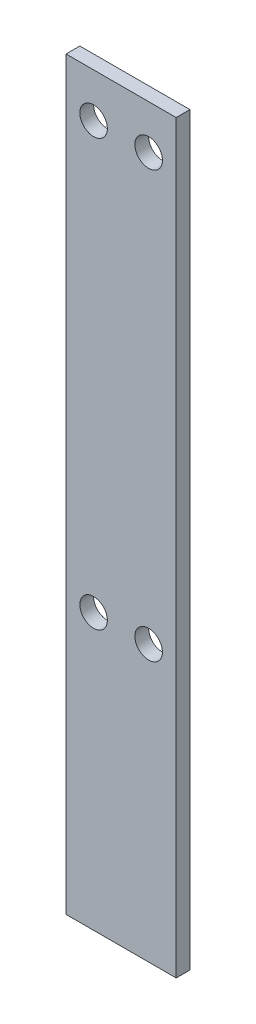
ISO-10303-21;
HEADER;
FILE_DESCRIPTION(('STEP AP214'),'2;1');
FILE_NAME('part.step','',(''),(''),'','','');
FILE_SCHEMA(('AUTOMOTIVE_DESIGN { 1 0 10303 214 1 1 1 1 }'));
ENDSEC;
DATA;
#1=APPLICATION_CONTEXT('core data for automotive mechanical design processes');
#2=APPLICATION_PROTOCOL_DEFINITION('international standard','automotive_design',2000,#1);
#3=PRODUCT_CONTEXT('',#1,'mechanical');
#4=PRODUCT('Part','Part','',(#3));
#5=PRODUCT_RELATED_PRODUCT_CATEGORY('part','',(#4));
#6=PRODUCT_DEFINITION_FORMATION('','',#4);
#7=PRODUCT_DEFINITION_CONTEXT('part definition',#1,'design');
#8=PRODUCT_DEFINITION('design','',#6,#7);
#9=PRODUCT_DEFINITION_SHAPE('','',#8);
#10=(LENGTH_UNIT() NAMED_UNIT(*) SI_UNIT(.MILLI.,.METRE.));
#11=(NAMED_UNIT(*) PLANE_ANGLE_UNIT() SI_UNIT($,.RADIAN.));
#12=(NAMED_UNIT(*) SI_UNIT($,.STERADIAN.) SOLID_ANGLE_UNIT());
#13=UNCERTAINTY_MEASURE_WITH_UNIT(LENGTH_MEASURE(1.E-05),#10,'distance_accuracy_value','');
#14=(GEOMETRIC_REPRESENTATION_CONTEXT(3) GLOBAL_UNCERTAINTY_ASSIGNED_CONTEXT((#13)) GLOBAL_UNIT_ASSIGNED_CONTEXT((#10,
#11,#12)) REPRESENTATION_CONTEXT('',''));
#15=CARTESIAN_POINT('',(0.,0.,0.));
#16=DIRECTION('',(0.,0.,1.));
#17=DIRECTION('',(1.,0.,0.));
#18=AXIS2_PLACEMENT_3D('',#15,#16,#17);
#19=CARTESIAN_POINT('',(0.,0.,4.7625));
#20=DIRECTION('',(0.,0.,-1.));
#21=DIRECTION('',(-1.,0.,0.));
#22=AXIS2_PLACEMENT_3D('',#19,#20,#21);
#23=PLANE('',#22);
#24=DIRECTION('',(0.,-1.,0.));
#25=VECTOR('',#24,1.);
#26=CARTESIAN_POINT('',(0.,0.,4.7625));
#27=LINE('',#26,#25);
#28=CARTESIAN_POINT('',(0.,257.81,4.7625));
#29=VERTEX_POINT('',#28);
#30=CARTESIAN_POINT('',(0.,0.,4.7625));
#31=VERTEX_POINT('',#30);
#32=EDGE_CURVE('E96',#29,#31,#27,.T.);
#33=ORIENTED_EDGE('',*,*,#32,.T.);
#34=DIRECTION('',(1.,0.,0.));
#35=VECTOR('',#34,1.);
#36=CARTESIAN_POINT('',(0.,0.,4.7625));
#37=LINE('',#36,#35);
#38=CARTESIAN_POINT('',(38.1,0.,4.7625));
#39=VERTEX_POINT('',#38);
#40=EDGE_CURVE('E91',#31,#39,#37,.T.);
#41=ORIENTED_EDGE('',*,*,#40,.T.);
#42=DIRECTION('',(0.,1.,0.));
#43=VECTOR('',#42,1.);
#44=CARTESIAN_POINT('',(38.1,0.,4.7625));
#45=LINE('',#44,#43);
#46=CARTESIAN_POINT('',(38.1,257.81,4.7625));
#47=VERTEX_POINT('',#46);
#48=EDGE_CURVE('E94',#39,#47,#45,.T.);
#49=ORIENTED_EDGE('',*,*,#48,.T.);
#50=DIRECTION('',(-1.,0.,0.));
#51=VECTOR('',#50,1.);
#52=CARTESIAN_POINT('',(0.,257.81,4.7625));
#53=LINE('',#52,#51);
#54=EDGE_CURVE('E61',#47,#29,#53,.T.);
#55=ORIENTED_EDGE('',*,*,#54,.T.);
#56=EDGE_LOOP('',(#33,#41,#49,#55));
#57=FACE_BOUND('',#56,.T.);
#58=CARTESIAN_POINT('',(9.525,95.25,4.7625));
#59=DIRECTION('',(0.,0.,1.));
#60=DIRECTION('',(1.,0.,0.));
#61=AXIS2_PLACEMENT_3D('',#58,#59,#60);
#62=CIRCLE('',#61,4.7625);
#63=CARTESIAN_POINT('',(4.7625,95.25,4.7625));
#64=VERTEX_POINT('',#63);
#65=EDGE_CURVE('E116',#64,#64,#62,.T.);
#66=ORIENTED_EDGE('',*,*,#65,.F.);
#67=EDGE_LOOP('',(#66));
#68=FACE_BOUND('',#67,.T.);
#69=CARTESIAN_POINT('',(28.575,95.25,4.7625));
#70=DIRECTION('',(0.,0.,1.));
#71=DIRECTION('',(1.,0.,0.));
#72=AXIS2_PLACEMENT_3D('',#69,#70,#71);
#73=CIRCLE('',#72,4.7625);
#74=CARTESIAN_POINT('',(23.8125,95.25,4.7625));
#75=VERTEX_POINT('',#74);
#76=EDGE_CURVE('E138',#75,#75,#73,.T.);
#77=ORIENTED_EDGE('',*,*,#76,.F.);
#78=EDGE_LOOP('',(#77));
#79=FACE_BOUND('',#78,.T.);
#80=CARTESIAN_POINT('',(9.525,242.57,4.7625));
#81=DIRECTION('',(0.,0.,1.));
#82=DIRECTION('',(1.,0.,0.));
#83=AXIS2_PLACEMENT_3D('',#80,#81,#82);
#84=CIRCLE('',#83,4.7625);
#85=CARTESIAN_POINT('',(4.76250000000001,242.57,4.7625));
#86=VERTEX_POINT('',#85);
#87=EDGE_CURVE('E146',#86,#86,#84,.T.);
#88=ORIENTED_EDGE('',*,*,#87,.F.);
#89=EDGE_LOOP('',(#88));
#90=FACE_BOUND('',#89,.T.);
#91=CARTESIAN_POINT('',(28.575,242.57,4.7625));
#92=DIRECTION('',(0.,0.,1.));
#93=DIRECTION('',(1.,0.,0.));
#94=AXIS2_PLACEMENT_3D('',#91,#92,#93);
#95=CIRCLE('',#94,4.7625);
#96=CARTESIAN_POINT('',(23.8125,242.57,4.7625));
#97=VERTEX_POINT('',#96);
#98=EDGE_CURVE('E154',#97,#97,#95,.T.);
#99=ORIENTED_EDGE('',*,*,#98,.F.);
#100=EDGE_LOOP('',(#99));
#101=FACE_BOUND('',#100,.T.);
#102=ADVANCED_FACE('F43',(#57,#68,#79,#90,#101),#23,.F.);
#103=CARTESIAN_POINT('',(0.,0.,0.));
#104=DIRECTION('',(0.,0.,-1.));
#105=DIRECTION('',(-1.,0.,0.));
#106=AXIS2_PLACEMENT_3D('',#103,#104,#105);
#107=PLANE('',#106);
#108=CARTESIAN_POINT('',(9.525,242.57,0.));
#109=DIRECTION('',(0.,0.,1.));
#110=DIRECTION('',(1.,0.,0.));
#111=AXIS2_PLACEMENT_3D('',#108,#109,#110);
#112=CIRCLE('',#111,4.7625);
#113=CARTESIAN_POINT('',(4.76250000000001,242.57,0.));
#114=VERTEX_POINT('',#113);
#115=EDGE_CURVE('E150',#114,#114,#112,.T.);
#116=ORIENTED_EDGE('',*,*,#115,.T.);
#117=EDGE_LOOP('',(#116));
#118=FACE_BOUND('',#117,.T.);
#119=CARTESIAN_POINT('',(9.525,95.25,0.));
#120=DIRECTION('',(0.,0.,1.));
#121=DIRECTION('',(1.,0.,0.));
#122=AXIS2_PLACEMENT_3D('',#119,#120,#121);
#123=CIRCLE('',#122,4.7625);
#124=CARTESIAN_POINT('',(4.7625,95.25,0.));
#125=VERTEX_POINT('',#124);
#126=EDGE_CURVE('E134',#125,#125,#123,.T.);
#127=ORIENTED_EDGE('',*,*,#126,.T.);
#128=EDGE_LOOP('',(#127));
#129=FACE_BOUND('',#128,.T.);
#130=DIRECTION('',(0.,-1.,0.));
#131=VECTOR('',#130,1.);
#132=CARTESIAN_POINT('',(0.,0.,0.));
#133=LINE('',#132,#131);
#134=CARTESIAN_POINT('',(0.,257.81,0.));
#135=VERTEX_POINT('',#134);
#136=CARTESIAN_POINT('',(0.,0.,0.));
#137=VERTEX_POINT('',#136);
#138=EDGE_CURVE('E112',#135,#137,#133,.T.);
#139=ORIENTED_EDGE('',*,*,#138,.F.);
#140=DIRECTION('',(-1.,0.,0.));
#141=VECTOR('',#140,1.);
#142=CARTESIAN_POINT('',(0.,257.81,0.));
#143=LINE('',#142,#141);
#144=CARTESIAN_POINT('',(38.1,257.81,0.));
#145=VERTEX_POINT('',#144);
#146=EDGE_CURVE('E84',#145,#135,#143,.T.);
#147=ORIENTED_EDGE('',*,*,#146,.F.);
#148=DIRECTION('',(0.,1.,0.));
#149=VECTOR('',#148,1.);
#150=CARTESIAN_POINT('',(38.1,0.,0.));
#151=LINE('',#150,#149);
#152=CARTESIAN_POINT('',(38.1,0.,0.));
#153=VERTEX_POINT('',#152);
#154=EDGE_CURVE('E78',#153,#145,#151,.T.);
#155=ORIENTED_EDGE('',*,*,#154,.F.);
#156=DIRECTION('',(1.,0.,0.));
#157=VECTOR('',#156,1.);
#158=CARTESIAN_POINT('',(0.,0.,0.));
#159=LINE('',#158,#157);
#160=EDGE_CURVE('E101',#137,#153,#159,.T.);
#161=ORIENTED_EDGE('',*,*,#160,.F.);
#162=EDGE_LOOP('',(#139,#147,#155,#161));
#163=FACE_BOUND('',#162,.T.);
#164=CARTESIAN_POINT('',(28.575,95.25,0.));
#165=DIRECTION('',(0.,0.,1.));
#166=DIRECTION('',(1.,0.,0.));
#167=AXIS2_PLACEMENT_3D('',#164,#165,#166);
#168=CIRCLE('',#167,4.7625);
#169=CARTESIAN_POINT('',(23.8125,95.25,0.));
#170=VERTEX_POINT('',#169);
#171=EDGE_CURVE('E142',#170,#170,#168,.T.);
#172=ORIENTED_EDGE('',*,*,#171,.T.);
#173=EDGE_LOOP('',(#172));
#174=FACE_BOUND('',#173,.T.);
#175=CARTESIAN_POINT('',(28.575,242.57,0.));
#176=DIRECTION('',(0.,0.,1.));
#177=DIRECTION('',(1.,0.,0.));
#178=AXIS2_PLACEMENT_3D('',#175,#176,#177);
#179=CIRCLE('',#178,4.7625);
#180=CARTESIAN_POINT('',(23.8125,242.57,0.));
#181=VERTEX_POINT('',#180);
#182=EDGE_CURVE('E158',#181,#181,#179,.T.);
#183=ORIENTED_EDGE('',*,*,#182,.T.);
#184=EDGE_LOOP('',(#183));
#185=FACE_BOUND('',#184,.T.);
#186=ADVANCED_FACE('F129',(#118,#129,#163,#174,#185),#107,.T.);
#187=CARTESIAN_POINT('',(0.,0.,4.7625));
#188=DIRECTION('',(1.,0.,0.));
#189=DIRECTION('',(0.,0.,-1.));
#190=AXIS2_PLACEMENT_3D('',#187,#188,#189);
#191=PLANE('',#190);
#192=ORIENTED_EDGE('',*,*,#138,.T.);
#193=DIRECTION('',(0.,0.,-1.));
#194=VECTOR('',#193,1.);
#195=CARTESIAN_POINT('',(0.,0.,4.7625));
#196=LINE('',#195,#194);
#197=EDGE_CURVE('E11',#31,#137,#196,.T.);
#198=ORIENTED_EDGE('',*,*,#197,.F.);
#199=ORIENTED_EDGE('',*,*,#32,.F.);
#200=DIRECTION('',(0.,0.,-1.));
#201=VECTOR('',#200,1.);
#202=CARTESIAN_POINT('',(0.,257.81,4.7625));
#203=LINE('',#202,#201);
#204=EDGE_CURVE('E108',#29,#135,#203,.T.);
#205=ORIENTED_EDGE('',*,*,#204,.T.);
#206=EDGE_LOOP('',(#192,#198,#199,#205));
#207=FACE_BOUND('',#206,.T.);
#208=ADVANCED_FACE('F45',(#207),#191,.F.);
#209=CARTESIAN_POINT('',(0.,0.,4.7625));
#210=DIRECTION('',(0.,1.,0.));
#211=DIRECTION('',(0.,0.,1.));
#212=AXIS2_PLACEMENT_3D('',#209,#210,#211);
#213=PLANE('',#212);
#214=ORIENTED_EDGE('',*,*,#160,.T.);
#215=DIRECTION('',(0.,0.,-1.));
#216=VECTOR('',#215,1.);
#217=CARTESIAN_POINT('',(38.1,0.,4.7625));
#218=LINE('',#217,#216);
#219=EDGE_CURVE('E53',#39,#153,#218,.T.);
#220=ORIENTED_EDGE('',*,*,#219,.F.);
#221=ORIENTED_EDGE('',*,*,#40,.F.);
#222=ORIENTED_EDGE('',*,*,#197,.T.);
#223=EDGE_LOOP('',(#214,#220,#221,#222));
#224=FACE_BOUND('',#223,.T.);
#225=ADVANCED_FACE('F100',(#224),#213,.F.);
#226=CARTESIAN_POINT('',(38.1,0.,4.7625));
#227=DIRECTION('',(-1.,0.,0.));
#228=DIRECTION('',(0.,0.,1.));
#229=AXIS2_PLACEMENT_3D('',#226,#227,#228);
#230=PLANE('',#229);
#231=ORIENTED_EDGE('',*,*,#154,.T.);
#232=DIRECTION('',(0.,0.,-1.));
#233=VECTOR('',#232,1.);
#234=CARTESIAN_POINT('',(38.1,257.81,4.7625));
#235=LINE('',#234,#233);
#236=EDGE_CURVE('E103',#47,#145,#235,.T.);
#237=ORIENTED_EDGE('',*,*,#236,.F.);
#238=ORIENTED_EDGE('',*,*,#48,.F.);
#239=ORIENTED_EDGE('',*,*,#219,.T.);
#240=EDGE_LOOP('',(#231,#237,#238,#239));
#241=FACE_BOUND('',#240,.T.);
#242=ADVANCED_FACE('F104',(#241),#230,.F.);
#243=CARTESIAN_POINT('',(0.,257.81,4.7625));
#244=DIRECTION('',(0.,-1.,0.));
#245=DIRECTION('',(0.,0.,-1.));
#246=AXIS2_PLACEMENT_3D('',#243,#244,#245);
#247=PLANE('',#246);
#248=ORIENTED_EDGE('',*,*,#146,.T.);
#249=ORIENTED_EDGE('',*,*,#204,.F.);
#250=ORIENTED_EDGE('',*,*,#54,.F.);
#251=ORIENTED_EDGE('',*,*,#236,.T.);
#252=EDGE_LOOP('',(#248,#249,#250,#251));
#253=FACE_BOUND('',#252,.T.);
#254=ADVANCED_FACE('F126',(#253),#247,.F.);
#255=CARTESIAN_POINT('',(9.525,95.25,4.7625));
#256=DIRECTION('',(0.,0.,-1.));
#257=DIRECTION('',(-1.,0.,0.));
#258=AXIS2_PLACEMENT_3D('',#255,#256,#257);
#259=CYLINDRICAL_SURFACE('',#258,4.7625);
#260=CARTESIAN_POINT('',(4.7625,95.25,4.7625));
#261=CARTESIAN_POINT('',(4.7625,95.25,4.712890625));
#262=CARTESIAN_POINT('',(4.7625,95.25,4.66328125));
#263=CARTESIAN_POINT('',(4.7625,95.25,4.5640625));
#264=CARTESIAN_POINT('',(4.7625,95.25,4.514453125));
#265=CARTESIAN_POINT('',(4.7625,95.25,4.415234375));
#266=CARTESIAN_POINT('',(4.7625,95.25,4.365625));
#267=CARTESIAN_POINT('',(4.7625,95.25,4.26640625));
#268=CARTESIAN_POINT('',(4.7625,95.25,4.216796875));
#269=CARTESIAN_POINT('',(4.7625,95.25,4.117578125));
#270=CARTESIAN_POINT('',(4.7625,95.25,4.06796875));
#271=CARTESIAN_POINT('',(4.7625,95.25,3.96875));
#272=CARTESIAN_POINT('',(4.7625,95.25,3.919140625));
#273=CARTESIAN_POINT('',(4.7625,95.25,3.819921875));
#274=CARTESIAN_POINT('',(4.7625,95.25,3.7703125));
#275=CARTESIAN_POINT('',(4.7625,95.25,3.67109375));
#276=CARTESIAN_POINT('',(4.7625,95.25,3.621484375));
#277=CARTESIAN_POINT('',(4.7625,95.25,3.522265625));
#278=CARTESIAN_POINT('',(4.7625,95.25,3.47265625));
#279=CARTESIAN_POINT('',(4.7625,95.25,3.3734375));
#280=CARTESIAN_POINT('',(4.7625,95.25,3.323828125));
#281=CARTESIAN_POINT('',(4.7625,95.25,3.224609375));
#282=CARTESIAN_POINT('',(4.7625,95.25,3.175));
#283=CARTESIAN_POINT('',(4.7625,95.25,3.07578125));
#284=CARTESIAN_POINT('',(4.7625,95.25,3.026171875));
#285=CARTESIAN_POINT('',(4.7625,95.25,2.926953125));
#286=CARTESIAN_POINT('',(4.7625,95.25,2.87734375));
#287=CARTESIAN_POINT('',(4.7625,95.25,2.778125));
#288=CARTESIAN_POINT('',(4.7625,95.25,2.728515625));
#289=CARTESIAN_POINT('',(4.7625,95.25,2.629296875));
#290=CARTESIAN_POINT('',(4.7625,95.25,2.5796875));
#291=CARTESIAN_POINT('',(4.7625,95.25,2.48046875));
#292=CARTESIAN_POINT('',(4.7625,95.25,2.430859375));
#293=CARTESIAN_POINT('',(4.7625,95.25,2.331640625));
#294=CARTESIAN_POINT('',(4.7625,95.25,2.28203125));
#295=CARTESIAN_POINT('',(4.7625,95.25,2.1828125));
#296=CARTESIAN_POINT('',(4.7625,95.25,2.133203125));
#297=CARTESIAN_POINT('',(4.7625,95.25,2.033984375));
#298=CARTESIAN_POINT('',(4.7625,95.25,1.984375));
#299=CARTESIAN_POINT('',(4.7625,95.25,1.88515625));
#300=CARTESIAN_POINT('',(4.7625,95.25,1.835546875));
#301=CARTESIAN_POINT('',(4.7625,95.25,1.736328125));
#302=CARTESIAN_POINT('',(4.7625,95.25,1.68671875));
#303=CARTESIAN_POINT('',(4.7625,95.25,1.5875));
#304=CARTESIAN_POINT('',(4.7625,95.25,1.537890625));
#305=CARTESIAN_POINT('',(4.7625,95.25,1.438671875));
#306=CARTESIAN_POINT('',(4.7625,95.25,1.3890625));
#307=CARTESIAN_POINT('',(4.7625,95.25,1.28984375));
#308=CARTESIAN_POINT('',(4.7625,95.25,1.240234375));
#309=CARTESIAN_POINT('',(4.7625,95.25,1.141015625));
#310=CARTESIAN_POINT('',(4.7625,95.25,1.09140625));
#311=CARTESIAN_POINT('',(4.7625,95.25,0.992187499999999));
#312=CARTESIAN_POINT('',(4.7625,95.25,0.942578124999999));
#313=CARTESIAN_POINT('',(4.7625,95.25,0.843359375));
#314=CARTESIAN_POINT('',(4.7625,95.25,0.79375));
#315=CARTESIAN_POINT('',(4.7625,95.25,0.69453125));
#316=CARTESIAN_POINT('',(4.7625,95.25,0.644921875));
#317=CARTESIAN_POINT('',(4.7625,95.25,0.545703125));
#318=CARTESIAN_POINT('',(4.7625,95.25,0.49609375));
#319=CARTESIAN_POINT('',(4.7625,95.25,0.396875));
#320=CARTESIAN_POINT('',(4.7625,95.25,0.347265625));
#321=CARTESIAN_POINT('',(4.7625,95.25,0.248046875));
#322=CARTESIAN_POINT('',(4.7625,95.25,0.1984375));
#323=CARTESIAN_POINT('',(4.7625,95.25,0.09921875));
#324=CARTESIAN_POINT('',(4.7625,95.25,0.049609375));
#325=CARTESIAN_POINT('',(4.7625,95.25,0.));
#326=B_SPLINE_CURVE_WITH_KNOTS('',3,(#260,#261,#262,#263,#264,#265,#266,#267,#268,#269,#270,
#271,#272,#273,#274,#275,#276,#277,#278,#279,#280,#281,#282,#283,#284,#285,#286,#287,#288,#289,
#290,#291,#292,#293,#294,#295,#296,#297,#298,#299,#300,#301,#302,#303,#304,#305,#306,#307,#308,
#309,#310,#311,#312,#313,#314,#315,#316,#317,#318,#319,#320,#321,#322,#323,#324,#325),
.UNSPECIFIED.,.F.,.F.,(4,2,2,2,2,2,2,2,2,2,2,2,2,2,2,2,2,2,2,2,2,2,2,2,2,2,2,2,2,2,2,2,4),(0.,
0.148828125,0.29765625,0.446484375,0.5953125,0.744140625,0.892968750000001,1.041796875,1.190625,
1.339453125,1.48828125,1.637109375,1.7859375,1.934765625,2.08359375,2.232421875,2.38125,
2.530078125,2.67890625,2.827734375,2.9765625,3.125390625,3.27421875,3.423046875,3.571875,
3.720703125,3.86953125,4.018359375,4.1671875,4.316015625,4.46484375,4.613671875,4.7625),.UNSPECIFIED.);
#327=EDGE_CURVE('BSEAM177',#64,#125,#326,.T.);
#328=ORIENTED_EDGE('',*,*,#65,.T.);
#329=ORIENTED_EDGE('',*,*,#126,.F.);
#330=ORIENTED_EDGE('',*,*,#327,.T.);
#331=ORIENTED_EDGE('',*,*,#327,.F.);
#332=EDGE_LOOP('',(#328,#330,#329,#331));
#333=FACE_BOUND('',#332,.T.);
#334=ADVANCED_FACE('F177',(#333),#259,.F.);
#335=CARTESIAN_POINT('',(28.575,95.25,4.7625));
#336=DIRECTION('',(0.,0.,-1.));
#337=DIRECTION('',(-1.,0.,0.));
#338=AXIS2_PLACEMENT_3D('',#335,#336,#337);
#339=CYLINDRICAL_SURFACE('',#338,4.7625);
#340=CARTESIAN_POINT('',(23.8125,95.25,4.7625));
#341=CARTESIAN_POINT('',(23.8125,95.25,4.712890625));
#342=CARTESIAN_POINT('',(23.8125,95.25,4.66328125));
#343=CARTESIAN_POINT('',(23.8125,95.25,4.5640625));
#344=CARTESIAN_POINT('',(23.8125,95.25,4.514453125));
#345=CARTESIAN_POINT('',(23.8125,95.25,4.415234375));
#346=CARTESIAN_POINT('',(23.8125,95.25,4.365625));
#347=CARTESIAN_POINT('',(23.8125,95.25,4.26640625));
#348=CARTESIAN_POINT('',(23.8125,95.25,4.216796875));
#349=CARTESIAN_POINT('',(23.8125,95.25,4.117578125));
#350=CARTESIAN_POINT('',(23.8125,95.25,4.06796875));
#351=CARTESIAN_POINT('',(23.8125,95.25,3.96875));
#352=CARTESIAN_POINT('',(23.8125,95.25,3.919140625));
#353=CARTESIAN_POINT('',(23.8125,95.25,3.819921875));
#354=CARTESIAN_POINT('',(23.8125,95.25,3.7703125));
#355=CARTESIAN_POINT('',(23.8125,95.25,3.67109375));
#356=CARTESIAN_POINT('',(23.8125,95.25,3.621484375));
#357=CARTESIAN_POINT('',(23.8125,95.25,3.522265625));
#358=CARTESIAN_POINT('',(23.8125,95.25,3.47265625));
#359=CARTESIAN_POINT('',(23.8125,95.25,3.3734375));
#360=CARTESIAN_POINT('',(23.8125,95.25,3.323828125));
#361=CARTESIAN_POINT('',(23.8125,95.25,3.224609375));
#362=CARTESIAN_POINT('',(23.8125,95.25,3.175));
#363=CARTESIAN_POINT('',(23.8125,95.25,3.07578125));
#364=CARTESIAN_POINT('',(23.8125,95.25,3.026171875));
#365=CARTESIAN_POINT('',(23.8125,95.25,2.926953125));
#366=CARTESIAN_POINT('',(23.8125,95.25,2.87734375));
#367=CARTESIAN_POINT('',(23.8125,95.25,2.778125));
#368=CARTESIAN_POINT('',(23.8125,95.25,2.728515625));
#369=CARTESIAN_POINT('',(23.8125,95.25,2.629296875));
#370=CARTESIAN_POINT('',(23.8125,95.25,2.5796875));
#371=CARTESIAN_POINT('',(23.8125,95.25,2.48046875));
#372=CARTESIAN_POINT('',(23.8125,95.25,2.430859375));
#373=CARTESIAN_POINT('',(23.8125,95.25,2.331640625));
#374=CARTESIAN_POINT('',(23.8125,95.25,2.28203125));
#375=CARTESIAN_POINT('',(23.8125,95.25,2.1828125));
#376=CARTESIAN_POINT('',(23.8125,95.25,2.133203125));
#377=CARTESIAN_POINT('',(23.8125,95.25,2.033984375));
#378=CARTESIAN_POINT('',(23.8125,95.25,1.984375));
#379=CARTESIAN_POINT('',(23.8125,95.25,1.88515625));
#380=CARTESIAN_POINT('',(23.8125,95.25,1.835546875));
#381=CARTESIAN_POINT('',(23.8125,95.25,1.736328125));
#382=CARTESIAN_POINT('',(23.8125,95.25,1.68671875));
#383=CARTESIAN_POINT('',(23.8125,95.25,1.5875));
#384=CARTESIAN_POINT('',(23.8125,95.25,1.537890625));
#385=CARTESIAN_POINT('',(23.8125,95.25,1.438671875));
#386=CARTESIAN_POINT('',(23.8125,95.25,1.3890625));
#387=CARTESIAN_POINT('',(23.8125,95.25,1.28984375));
#388=CARTESIAN_POINT('',(23.8125,95.25,1.240234375));
#389=CARTESIAN_POINT('',(23.8125,95.25,1.141015625));
#390=CARTESIAN_POINT('',(23.8125,95.25,1.09140625));
#391=CARTESIAN_POINT('',(23.8125,95.25,0.992187499999999));
#392=CARTESIAN_POINT('',(23.8125,95.25,0.942578124999999));
#393=CARTESIAN_POINT('',(23.8125,95.25,0.843359375));
#394=CARTESIAN_POINT('',(23.8125,95.25,0.79375));
#395=CARTESIAN_POINT('',(23.8125,95.25,0.69453125));
#396=CARTESIAN_POINT('',(23.8125,95.25,0.644921875));
#397=CARTESIAN_POINT('',(23.8125,95.25,0.545703125));
#398=CARTESIAN_POINT('',(23.8125,95.25,0.49609375));
#399=CARTESIAN_POINT('',(23.8125,95.25,0.396875));
#400=CARTESIAN_POINT('',(23.8125,95.25,0.347265625));
#401=CARTESIAN_POINT('',(23.8125,95.25,0.248046875));
#402=CARTESIAN_POINT('',(23.8125,95.25,0.1984375));
#403=CARTESIAN_POINT('',(23.8125,95.25,0.09921875));
#404=CARTESIAN_POINT('',(23.8125,95.25,0.049609375));
#405=CARTESIAN_POINT('',(23.8125,95.25,0.));
#406=B_SPLINE_CURVE_WITH_KNOTS('',3,(#340,#341,#342,#343,#344,#345,#346,#347,#348,#349,#350,
#351,#352,#353,#354,#355,#356,#357,#358,#359,#360,#361,#362,#363,#364,#365,#366,#367,#368,#369,
#370,#371,#372,#373,#374,#375,#376,#377,#378,#379,#380,#381,#382,#383,#384,#385,#386,#387,#388,
#389,#390,#391,#392,#393,#394,#395,#396,#397,#398,#399,#400,#401,#402,#403,#404,#405),
.UNSPECIFIED.,.F.,.F.,(4,2,2,2,2,2,2,2,2,2,2,2,2,2,2,2,2,2,2,2,2,2,2,2,2,2,2,2,2,2,2,2,4),(0.,
0.148828125,0.29765625,0.446484375,0.5953125,0.744140625,0.892968750000001,1.041796875,1.190625,
1.339453125,1.48828125,1.637109375,1.7859375,1.934765625,2.08359375,2.232421875,2.38125,
2.530078125,2.67890625,2.827734375,2.9765625,3.125390625,3.27421875,3.423046875,3.571875,
3.720703125,3.86953125,4.018359375,4.1671875,4.316015625,4.46484375,4.613671875,4.7625),.UNSPECIFIED.);
#407=EDGE_CURVE('BSEAM231',#75,#170,#406,.T.);
#408=ORIENTED_EDGE('',*,*,#76,.T.);
#409=ORIENTED_EDGE('',*,*,#171,.F.);
#410=ORIENTED_EDGE('',*,*,#407,.T.);
#411=ORIENTED_EDGE('',*,*,#407,.F.);
#412=EDGE_LOOP('',(#408,#410,#409,#411));
#413=FACE_BOUND('',#412,.T.);
#414=ADVANCED_FACE('F231',(#413),#339,.F.);
#415=CARTESIAN_POINT('',(9.525,242.57,4.7625));
#416=DIRECTION('',(0.,0.,-1.));
#417=DIRECTION('',(-1.,0.,0.));
#418=AXIS2_PLACEMENT_3D('',#415,#416,#417);
#419=CYLINDRICAL_SURFACE('',#418,4.7625);
#420=CARTESIAN_POINT('',(4.76250000000001,242.57,4.7625));
#421=CARTESIAN_POINT('',(4.76250000000001,242.57,4.712890625));
#422=CARTESIAN_POINT('',(4.76250000000001,242.57,4.66328125));
#423=CARTESIAN_POINT('',(4.76250000000001,242.57,4.5640625));
#424=CARTESIAN_POINT('',(4.76250000000001,242.57,4.514453125));
#425=CARTESIAN_POINT('',(4.76250000000001,242.57,4.415234375));
#426=CARTESIAN_POINT('',(4.76250000000001,242.57,4.365625));
#427=CARTESIAN_POINT('',(4.76250000000001,242.57,4.26640625));
#428=CARTESIAN_POINT('',(4.76250000000001,242.57,4.216796875));
#429=CARTESIAN_POINT('',(4.76250000000001,242.57,4.117578125));
#430=CARTESIAN_POINT('',(4.76250000000001,242.57,4.06796875));
#431=CARTESIAN_POINT('',(4.76250000000001,242.57,3.96875));
#432=CARTESIAN_POINT('',(4.76250000000001,242.57,3.919140625));
#433=CARTESIAN_POINT('',(4.76250000000001,242.57,3.819921875));
#434=CARTESIAN_POINT('',(4.76250000000001,242.57,3.7703125));
#435=CARTESIAN_POINT('',(4.76250000000001,242.57,3.67109375));
#436=CARTESIAN_POINT('',(4.76250000000001,242.57,3.621484375));
#437=CARTESIAN_POINT('',(4.76250000000001,242.57,3.522265625));
#438=CARTESIAN_POINT('',(4.76250000000001,242.57,3.47265625));
#439=CARTESIAN_POINT('',(4.76250000000001,242.57,3.3734375));
#440=CARTESIAN_POINT('',(4.76250000000001,242.57,3.323828125));
#441=CARTESIAN_POINT('',(4.76250000000001,242.57,3.224609375));
#442=CARTESIAN_POINT('',(4.76250000000001,242.57,3.175));
#443=CARTESIAN_POINT('',(4.76250000000001,242.57,3.07578125));
#444=CARTESIAN_POINT('',(4.76250000000001,242.57,3.026171875));
#445=CARTESIAN_POINT('',(4.76250000000001,242.57,2.926953125));
#446=CARTESIAN_POINT('',(4.76250000000001,242.57,2.87734375));
#447=CARTESIAN_POINT('',(4.76250000000001,242.57,2.778125));
#448=CARTESIAN_POINT('',(4.76250000000001,242.57,2.728515625));
#449=CARTESIAN_POINT('',(4.76250000000001,242.57,2.629296875));
#450=CARTESIAN_POINT('',(4.76250000000001,242.57,2.5796875));
#451=CARTESIAN_POINT('',(4.76250000000001,242.57,2.48046875));
#452=CARTESIAN_POINT('',(4.76250000000001,242.57,2.430859375));
#453=CARTESIAN_POINT('',(4.76250000000001,242.57,2.331640625));
#454=CARTESIAN_POINT('',(4.76250000000001,242.57,2.28203125));
#455=CARTESIAN_POINT('',(4.76250000000001,242.57,2.1828125));
#456=CARTESIAN_POINT('',(4.76250000000001,242.57,2.133203125));
#457=CARTESIAN_POINT('',(4.76250000000001,242.57,2.033984375));
#458=CARTESIAN_POINT('',(4.76250000000001,242.57,1.984375));
#459=CARTESIAN_POINT('',(4.76250000000001,242.57,1.88515625));
#460=CARTESIAN_POINT('',(4.76250000000001,242.57,1.835546875));
#461=CARTESIAN_POINT('',(4.76250000000001,242.57,1.736328125));
#462=CARTESIAN_POINT('',(4.76250000000001,242.57,1.68671875));
#463=CARTESIAN_POINT('',(4.76250000000001,242.57,1.5875));
#464=CARTESIAN_POINT('',(4.76250000000001,242.57,1.537890625));
#465=CARTESIAN_POINT('',(4.76250000000001,242.57,1.438671875));
#466=CARTESIAN_POINT('',(4.76250000000001,242.57,1.3890625));
#467=CARTESIAN_POINT('',(4.76250000000001,242.57,1.28984375));
#468=CARTESIAN_POINT('',(4.76250000000001,242.57,1.240234375));
#469=CARTESIAN_POINT('',(4.76250000000001,242.57,1.141015625));
#470=CARTESIAN_POINT('',(4.76250000000001,242.57,1.09140625));
#471=CARTESIAN_POINT('',(4.76250000000001,242.57,0.992187499999999));
#472=CARTESIAN_POINT('',(4.76250000000001,242.57,0.942578124999999));
#473=CARTESIAN_POINT('',(4.76250000000001,242.57,0.843359375));
#474=CARTESIAN_POINT('',(4.76250000000001,242.57,0.79375));
#475=CARTESIAN_POINT('',(4.76250000000001,242.57,0.69453125));
#476=CARTESIAN_POINT('',(4.76250000000001,242.57,0.644921875));
#477=CARTESIAN_POINT('',(4.76250000000001,242.57,0.545703125));
#478=CARTESIAN_POINT('',(4.76250000000001,242.57,0.49609375));
#479=CARTESIAN_POINT('',(4.76250000000001,242.57,0.396875));
#480=CARTESIAN_POINT('',(4.76250000000001,242.57,0.347265625));
#481=CARTESIAN_POINT('',(4.76250000000001,242.57,0.248046875));
#482=CARTESIAN_POINT('',(4.76250000000001,242.57,0.1984375));
#483=CARTESIAN_POINT('',(4.76250000000001,242.57,0.09921875));
#484=CARTESIAN_POINT('',(4.76250000000001,242.57,0.049609375));
#485=CARTESIAN_POINT('',(4.76250000000001,242.57,0.));
#486=B_SPLINE_CURVE_WITH_KNOTS('',3,(#420,#421,#422,#423,#424,#425,#426,#427,#428,#429,#430,
#431,#432,#433,#434,#435,#436,#437,#438,#439,#440,#441,#442,#443,#444,#445,#446,#447,#448,#449,
#450,#451,#452,#453,#454,#455,#456,#457,#458,#459,#460,#461,#462,#463,#464,#465,#466,#467,#468,
#469,#470,#471,#472,#473,#474,#475,#476,#477,#478,#479,#480,#481,#482,#483,#484,#485),
.UNSPECIFIED.,.F.,.F.,(4,2,2,2,2,2,2,2,2,2,2,2,2,2,2,2,2,2,2,2,2,2,2,2,2,2,2,2,2,2,2,2,4),(0.,
0.148828125,0.29765625,0.446484375,0.5953125,0.744140625,0.892968750000001,1.041796875,1.190625,
1.339453125,1.48828125,1.637109375,1.7859375,1.934765625,2.08359375,2.232421875,2.38125,
2.530078125,2.67890625,2.827734375,2.9765625,3.125390625,3.27421875,3.423046875,3.571875,
3.720703125,3.86953125,4.018359375,4.1671875,4.316015625,4.46484375,4.613671875,4.7625),.UNSPECIFIED.);
#487=EDGE_CURVE('BSEAM240',#86,#114,#486,.T.);
#488=ORIENTED_EDGE('',*,*,#87,.T.);
#489=ORIENTED_EDGE('',*,*,#115,.F.);
#490=ORIENTED_EDGE('',*,*,#487,.T.);
#491=ORIENTED_EDGE('',*,*,#487,.F.);
#492=EDGE_LOOP('',(#488,#490,#489,#491));
#493=FACE_BOUND('',#492,.T.);
#494=ADVANCED_FACE('F240',(#493),#419,.F.);
#495=CARTESIAN_POINT('',(28.575,242.57,4.7625));
#496=DIRECTION('',(0.,0.,-1.));
#497=DIRECTION('',(-1.,0.,0.));
#498=AXIS2_PLACEMENT_3D('',#495,#496,#497);
#499=CYLINDRICAL_SURFACE('',#498,4.7625);
#500=CARTESIAN_POINT('',(23.8125,242.57,4.7625));
#501=CARTESIAN_POINT('',(23.8125,242.57,4.712890625));
#502=CARTESIAN_POINT('',(23.8125,242.57,4.66328125));
#503=CARTESIAN_POINT('',(23.8125,242.57,4.5640625));
#504=CARTESIAN_POINT('',(23.8125,242.57,4.514453125));
#505=CARTESIAN_POINT('',(23.8125,242.57,4.415234375));
#506=CARTESIAN_POINT('',(23.8125,242.57,4.365625));
#507=CARTESIAN_POINT('',(23.8125,242.57,4.26640625));
#508=CARTESIAN_POINT('',(23.8125,242.57,4.216796875));
#509=CARTESIAN_POINT('',(23.8125,242.57,4.117578125));
#510=CARTESIAN_POINT('',(23.8125,242.57,4.06796875));
#511=CARTESIAN_POINT('',(23.8125,242.57,3.96875));
#512=CARTESIAN_POINT('',(23.8125,242.57,3.919140625));
#513=CARTESIAN_POINT('',(23.8125,242.57,3.819921875));
#514=CARTESIAN_POINT('',(23.8125,242.57,3.7703125));
#515=CARTESIAN_POINT('',(23.8125,242.57,3.67109375));
#516=CARTESIAN_POINT('',(23.8125,242.57,3.621484375));
#517=CARTESIAN_POINT('',(23.8125,242.57,3.522265625));
#518=CARTESIAN_POINT('',(23.8125,242.57,3.47265625));
#519=CARTESIAN_POINT('',(23.8125,242.57,3.3734375));
#520=CARTESIAN_POINT('',(23.8125,242.57,3.323828125));
#521=CARTESIAN_POINT('',(23.8125,242.57,3.224609375));
#522=CARTESIAN_POINT('',(23.8125,242.57,3.175));
#523=CARTESIAN_POINT('',(23.8125,242.57,3.07578125));
#524=CARTESIAN_POINT('',(23.8125,242.57,3.026171875));
#525=CARTESIAN_POINT('',(23.8125,242.57,2.926953125));
#526=CARTESIAN_POINT('',(23.8125,242.57,2.87734375));
#527=CARTESIAN_POINT('',(23.8125,242.57,2.778125));
#528=CARTESIAN_POINT('',(23.8125,242.57,2.728515625));
#529=CARTESIAN_POINT('',(23.8125,242.57,2.629296875));
#530=CARTESIAN_POINT('',(23.8125,242.57,2.5796875));
#531=CARTESIAN_POINT('',(23.8125,242.57,2.48046875));
#532=CARTESIAN_POINT('',(23.8125,242.57,2.430859375));
#533=CARTESIAN_POINT('',(23.8125,242.57,2.331640625));
#534=CARTESIAN_POINT('',(23.8125,242.57,2.28203125));
#535=CARTESIAN_POINT('',(23.8125,242.57,2.1828125));
#536=CARTESIAN_POINT('',(23.8125,242.57,2.133203125));
#537=CARTESIAN_POINT('',(23.8125,242.57,2.033984375));
#538=CARTESIAN_POINT('',(23.8125,242.57,1.984375));
#539=CARTESIAN_POINT('',(23.8125,242.57,1.88515625));
#540=CARTESIAN_POINT('',(23.8125,242.57,1.835546875));
#541=CARTESIAN_POINT('',(23.8125,242.57,1.736328125));
#542=CARTESIAN_POINT('',(23.8125,242.57,1.68671875));
#543=CARTESIAN_POINT('',(23.8125,242.57,1.5875));
#544=CARTESIAN_POINT('',(23.8125,242.57,1.537890625));
#545=CARTESIAN_POINT('',(23.8125,242.57,1.438671875));
#546=CARTESIAN_POINT('',(23.8125,242.57,1.3890625));
#547=CARTESIAN_POINT('',(23.8125,242.57,1.28984375));
#548=CARTESIAN_POINT('',(23.8125,242.57,1.240234375));
#549=CARTESIAN_POINT('',(23.8125,242.57,1.141015625));
#550=CARTESIAN_POINT('',(23.8125,242.57,1.09140625));
#551=CARTESIAN_POINT('',(23.8125,242.57,0.992187499999999));
#552=CARTESIAN_POINT('',(23.8125,242.57,0.942578124999999));
#553=CARTESIAN_POINT('',(23.8125,242.57,0.843359375));
#554=CARTESIAN_POINT('',(23.8125,242.57,0.79375));
#555=CARTESIAN_POINT('',(23.8125,242.57,0.69453125));
#556=CARTESIAN_POINT('',(23.8125,242.57,0.644921875));
#557=CARTESIAN_POINT('',(23.8125,242.57,0.545703125));
#558=CARTESIAN_POINT('',(23.8125,242.57,0.49609375));
#559=CARTESIAN_POINT('',(23.8125,242.57,0.396875));
#560=CARTESIAN_POINT('',(23.8125,242.57,0.347265625));
#561=CARTESIAN_POINT('',(23.8125,242.57,0.248046875));
#562=CARTESIAN_POINT('',(23.8125,242.57,0.1984375));
#563=CARTESIAN_POINT('',(23.8125,242.57,0.09921875));
#564=CARTESIAN_POINT('',(23.8125,242.57,0.049609375));
#565=CARTESIAN_POINT('',(23.8125,242.57,0.));
#566=B_SPLINE_CURVE_WITH_KNOTS('',3,(#500,#501,#502,#503,#504,#505,#506,#507,#508,#509,#510,
#511,#512,#513,#514,#515,#516,#517,#518,#519,#520,#521,#522,#523,#524,#525,#526,#527,#528,#529,
#530,#531,#532,#533,#534,#535,#536,#537,#538,#539,#540,#541,#542,#543,#544,#545,#546,#547,#548,
#549,#550,#551,#552,#553,#554,#555,#556,#557,#558,#559,#560,#561,#562,#563,#564,#565),
.UNSPECIFIED.,.F.,.F.,(4,2,2,2,2,2,2,2,2,2,2,2,2,2,2,2,2,2,2,2,2,2,2,2,2,2,2,2,2,2,2,2,4),(0.,
0.148828125,0.29765625,0.446484375,0.5953125,0.744140625,0.892968750000001,1.041796875,1.190625,
1.339453125,1.48828125,1.637109375,1.7859375,1.934765625,2.08359375,2.232421875,2.38125,
2.530078125,2.67890625,2.827734375,2.9765625,3.125390625,3.27421875,3.423046875,3.571875,
3.720703125,3.86953125,4.018359375,4.1671875,4.316015625,4.46484375,4.613671875,4.7625),.UNSPECIFIED.);
#567=EDGE_CURVE('BSEAM166',#97,#181,#566,.T.);
#568=ORIENTED_EDGE('',*,*,#98,.T.);
#569=ORIENTED_EDGE('',*,*,#182,.F.);
#570=ORIENTED_EDGE('',*,*,#567,.T.);
#571=ORIENTED_EDGE('',*,*,#567,.F.);
#572=EDGE_LOOP('',(#568,#570,#569,#571));
#573=FACE_BOUND('',#572,.T.);
#574=ADVANCED_FACE('F166',(#573),#499,.F.);
#575=CLOSED_SHELL('',(#102,#186,#208,#225,#242,#254,#334,#414,#494,#574));
#576=MANIFOLD_SOLID_BREP('B2',#575);
#577=ADVANCED_BREP_SHAPE_REPRESENTATION('',(#18,#576),#14);
#578=SHAPE_DEFINITION_REPRESENTATION(#9,#577);
ENDSEC;
END-ISO-10303-21;
